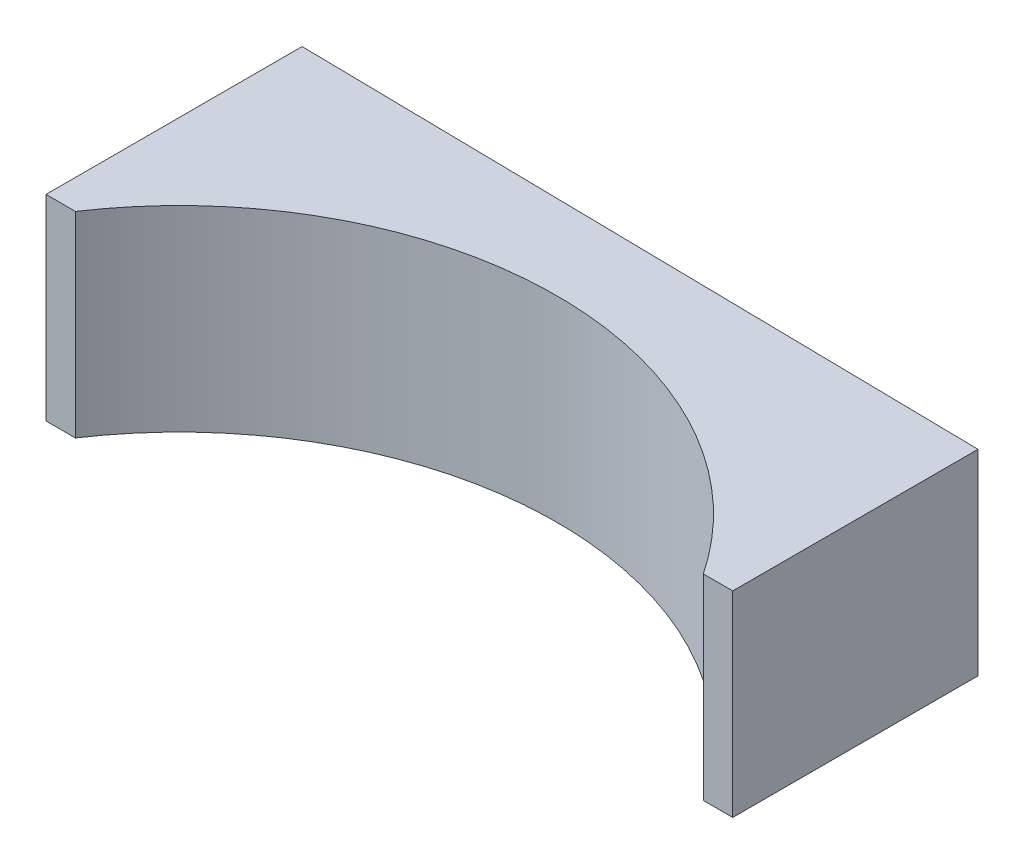
ISO-10303-21;
HEADER;
FILE_DESCRIPTION(('STEP AP214'),'2;1');
FILE_NAME('part.step','',(''),(''),'','','');
FILE_SCHEMA(('AUTOMOTIVE_DESIGN { 1 0 10303 214 1 1 1 1 }'));
ENDSEC;
DATA;
#1=APPLICATION_CONTEXT('core data for automotive mechanical design processes');
#2=APPLICATION_PROTOCOL_DEFINITION('international standard','automotive_design',2000,#1);
#3=PRODUCT_CONTEXT('',#1,'mechanical');
#4=PRODUCT('Part','Part','',(#3));
#5=PRODUCT_RELATED_PRODUCT_CATEGORY('part','',(#4));
#6=PRODUCT_DEFINITION_FORMATION('','',#4);
#7=PRODUCT_DEFINITION_CONTEXT('part definition',#1,'design');
#8=PRODUCT_DEFINITION('design','',#6,#7);
#9=PRODUCT_DEFINITION_SHAPE('','',#8);
#10=(LENGTH_UNIT() NAMED_UNIT(*) SI_UNIT(.MILLI.,.METRE.));
#11=(NAMED_UNIT(*) PLANE_ANGLE_UNIT() SI_UNIT($,.RADIAN.));
#12=(NAMED_UNIT(*) SI_UNIT($,.STERADIAN.) SOLID_ANGLE_UNIT());
#13=UNCERTAINTY_MEASURE_WITH_UNIT(LENGTH_MEASURE(1.E-05),#10,'distance_accuracy_value','');
#14=(GEOMETRIC_REPRESENTATION_CONTEXT(3) GLOBAL_UNCERTAINTY_ASSIGNED_CONTEXT((#13)) GLOBAL_UNIT_ASSIGNED_CONTEXT((#10,
#11,#12)) REPRESENTATION_CONTEXT('',''));
#15=CARTESIAN_POINT('',(0.,0.,0.));
#16=DIRECTION('',(0.,0.,1.));
#17=DIRECTION('',(1.,0.,0.));
#18=AXIS2_PLACEMENT_3D('',#15,#16,#17);
#19=CARTESIAN_POINT('',(-35.,-20.,-21.4067746286076));
#20=DIRECTION('',(0.,0.,-1.));
#21=DIRECTION('',(-1.,0.,0.));
#22=AXIS2_PLACEMENT_3D('',#19,#20,#21);
#23=PLANE('',#22);
#24=DIRECTION('',(-1.,0.,0.));
#25=VECTOR('',#24,1.);
#26=CARTESIAN_POINT('',(-35.,0.,-21.4067746286076));
#27=LINE('',#26,#25);
#28=CARTESIAN_POINT('',(-32.,0.,-21.4067746286076));
#29=VERTEX_POINT('',#28);
#30=CARTESIAN_POINT('',(-35.,0.,-21.4067746286076));
#31=VERTEX_POINT('',#30);
#32=EDGE_CURVE('E121',#29,#31,#27,.T.);
#33=ORIENTED_EDGE('',*,*,#32,.T.);
#34=DIRECTION('',(0.,1.,0.));
#35=VECTOR('',#34,1.);
#36=CARTESIAN_POINT('',(-35.,-20.,-21.4067746286076));
#37=LINE('',#36,#35);
#38=CARTESIAN_POINT('',(-35.,-20.,-21.4067746286076));
#39=VERTEX_POINT('',#38);
#40=EDGE_CURVE('E11',#39,#31,#37,.T.);
#41=ORIENTED_EDGE('',*,*,#40,.F.);
#42=DIRECTION('',(-1.,0.,0.));
#43=VECTOR('',#42,1.);
#44=CARTESIAN_POINT('',(-35.,-20.,-21.4067746286076));
#45=LINE('',#44,#43);
#46=CARTESIAN_POINT('',(-32.,-20.,-21.4067746286076));
#47=VERTEX_POINT('',#46);
#48=EDGE_CURVE('E131',#47,#39,#45,.T.);
#49=ORIENTED_EDGE('',*,*,#48,.F.);
#50=DIRECTION('',(0.,1.,0.));
#51=VECTOR('',#50,1.);
#52=CARTESIAN_POINT('',(-32.,-20.,-21.4067746286076));
#53=LINE('',#52,#51);
#54=EDGE_CURVE('E117',#47,#29,#53,.T.);
#55=ORIENTED_EDGE('',*,*,#54,.T.);
#56=EDGE_LOOP('',(#33,#41,#49,#55));
#57=FACE_BOUND('',#56,.T.);
#58=ADVANCED_FACE('F37',(#57),#23,.F.);
#59=CARTESIAN_POINT('',(-35.,-20.,-21.4067746286076));
#60=DIRECTION('',(1.,0.,0.));
#61=DIRECTION('',(0.,0.,-1.));
#62=AXIS2_PLACEMENT_3D('',#59,#60,#61);
#63=PLANE('',#62);
#64=DIRECTION('',(0.,0.,-1.));
#65=VECTOR('',#64,1.);
#66=CARTESIAN_POINT('',(-35.,0.,-21.4067746286076));
#67=LINE('',#66,#65);
#68=CARTESIAN_POINT('',(-35.,0.,-47.513101044593));
#69=VERTEX_POINT('',#68);
#70=EDGE_CURVE('E124',#31,#69,#67,.T.);
#71=ORIENTED_EDGE('',*,*,#70,.T.);
#72=DIRECTION('',(0.,1.,0.));
#73=VECTOR('',#72,1.);
#74=CARTESIAN_POINT('',(-35.,-20.,-47.513101044593));
#75=LINE('',#74,#73);
#76=CARTESIAN_POINT('',(-35.,-20.,-47.513101044593));
#77=VERTEX_POINT('',#76);
#78=EDGE_CURVE('E45',#77,#69,#75,.T.);
#79=ORIENTED_EDGE('',*,*,#78,.F.);
#80=DIRECTION('',(0.,0.,-1.));
#81=VECTOR('',#80,1.);
#82=CARTESIAN_POINT('',(-35.,-20.,-21.4067746286076));
#83=LINE('',#82,#81);
#84=EDGE_CURVE('E90',#39,#77,#83,.T.);
#85=ORIENTED_EDGE('',*,*,#84,.F.);
#86=ORIENTED_EDGE('',*,*,#40,.T.);
#87=EDGE_LOOP('',(#71,#79,#85,#86));
#88=FACE_BOUND('',#87,.T.);
#89=ADVANCED_FACE('F155',(#88),#63,.F.);
#90=CARTESIAN_POINT('',(-35.,-20.,-47.513101044593));
#91=DIRECTION('',(-0.0158026895525667,0.,0.999875129705157));
#92=DIRECTION('',(0.999875129705157,0.,0.0158026895525667));
#93=AXIS2_PLACEMENT_3D('',#90,#91,#92);
#94=PLANE('',#93);
#95=DIRECTION('',(0.999875129705157,0.,0.0158026895525667));
#96=VECTOR('',#95,1.);
#97=CARTESIAN_POINT('',(-35.,0.,-47.513101044593));
#98=LINE('',#97,#96);
#99=CARTESIAN_POINT('',(35.,0.,-46.4067746286076));
#100=VERTEX_POINT('',#99);
#101=EDGE_CURVE('E126',#69,#100,#98,.T.);
#102=ORIENTED_EDGE('',*,*,#101,.T.);
#103=DIRECTION('',(0.,1.,0.));
#104=VECTOR('',#103,1.);
#105=CARTESIAN_POINT('',(35.,-20.,-46.4067746286076));
#106=LINE('',#105,#104);
#107=CARTESIAN_POINT('',(35.,-20.,-46.4067746286076));
#108=VERTEX_POINT('',#107);
#109=EDGE_CURVE('E112',#108,#100,#106,.T.);
#110=ORIENTED_EDGE('',*,*,#109,.F.);
#111=DIRECTION('',(0.999875129705157,0.,0.0158026895525667));
#112=VECTOR('',#111,1.);
#113=CARTESIAN_POINT('',(-35.,-20.,-47.513101044593));
#114=LINE('',#113,#112);
#115=EDGE_CURVE('E103',#77,#108,#114,.T.);
#116=ORIENTED_EDGE('',*,*,#115,.F.);
#117=ORIENTED_EDGE('',*,*,#78,.T.);
#118=EDGE_LOOP('',(#102,#110,#116,#117));
#119=FACE_BOUND('',#118,.T.);
#120=ADVANCED_FACE('F137',(#119),#94,.F.);
#121=CARTESIAN_POINT('',(35.,-20.,-46.4067746286076));
#122=DIRECTION('',(-1.,0.,0.));
#123=DIRECTION('',(0.,0.,1.));
#124=AXIS2_PLACEMENT_3D('',#121,#122,#123);
#125=PLANE('',#124);
#126=DIRECTION('',(0.,0.,1.));
#127=VECTOR('',#126,1.);
#128=CARTESIAN_POINT('',(35.,0.,-46.4067746286076));
#129=LINE('',#128,#127);
#130=CARTESIAN_POINT('',(35.,0.,-21.4067746286076));
#131=VERTEX_POINT('',#130);
#132=EDGE_CURVE('E111',#100,#131,#129,.T.);
#133=ORIENTED_EDGE('',*,*,#132,.T.);
#134=DIRECTION('',(0.,1.,0.));
#135=VECTOR('',#134,1.);
#136=CARTESIAN_POINT('',(35.,-20.,-21.4067746286076));
#137=LINE('',#136,#135);
#138=CARTESIAN_POINT('',(35.,-20.,-21.4067746286076));
#139=VERTEX_POINT('',#138);
#140=EDGE_CURVE('E108',#139,#131,#137,.T.);
#141=ORIENTED_EDGE('',*,*,#140,.F.);
#142=DIRECTION('',(0.,0.,1.));
#143=VECTOR('',#142,1.);
#144=CARTESIAN_POINT('',(35.,-20.,-46.4067746286076));
#145=LINE('',#144,#143);
#146=EDGE_CURVE('E97',#108,#139,#145,.T.);
#147=ORIENTED_EDGE('',*,*,#146,.F.);
#148=ORIENTED_EDGE('',*,*,#109,.T.);
#149=EDGE_LOOP('',(#133,#141,#147,#148));
#150=FACE_BOUND('',#149,.T.);
#151=ADVANCED_FACE('F109',(#150),#125,.F.);
#152=CARTESIAN_POINT('',(35.,-20.,-21.4067746286076));
#153=DIRECTION('',(0.,0.,-1.));
#154=DIRECTION('',(-1.,0.,0.));
#155=AXIS2_PLACEMENT_3D('',#152,#153,#154);
#156=PLANE('',#155);
#157=DIRECTION('',(-1.,0.,0.));
#158=VECTOR('',#157,1.);
#159=CARTESIAN_POINT('',(35.,0.,-21.4067746286076));
#160=LINE('',#159,#158);
#161=CARTESIAN_POINT('',(32.,0.,-21.4067746286076));
#162=VERTEX_POINT('',#161);
#163=EDGE_CURVE('E76',#131,#162,#160,.T.);
#164=ORIENTED_EDGE('',*,*,#163,.T.);
#165=DIRECTION('',(0.,1.,0.));
#166=VECTOR('',#165,1.);
#167=CARTESIAN_POINT('',(32.,-20.,-21.4067746286076));
#168=LINE('',#167,#166);
#169=CARTESIAN_POINT('',(32.,-20.,-21.4067746286076));
#170=VERTEX_POINT('',#169);
#171=EDGE_CURVE('E113',#170,#162,#168,.T.);
#172=ORIENTED_EDGE('',*,*,#171,.F.);
#173=DIRECTION('',(-1.,0.,0.));
#174=VECTOR('',#173,1.);
#175=CARTESIAN_POINT('',(35.,-20.,-21.4067746286076));
#176=LINE('',#175,#174);
#177=EDGE_CURVE('E101',#139,#170,#176,.T.);
#178=ORIENTED_EDGE('',*,*,#177,.F.);
#179=ORIENTED_EDGE('',*,*,#140,.T.);
#180=EDGE_LOOP('',(#164,#172,#178,#179));
#181=FACE_BOUND('',#180,.T.);
#182=ADVANCED_FACE('F115',(#181),#156,.F.);
#183=CARTESIAN_POINT('',(0.,-20.,0.));
#184=DIRECTION('',(0.,1.,0.));
#185=DIRECTION('',(0.,0.,1.));
#186=AXIS2_PLACEMENT_3D('',#183,#184,#185);
#187=CYLINDRICAL_SURFACE('',#186,38.5);
#188=CARTESIAN_POINT('',(0.,0.,0.));
#189=DIRECTION('',(0.,1.,0.));
#190=DIRECTION('',(0.,0.,-1.));
#191=AXIS2_PLACEMENT_3D('',#188,#189,#190);
#192=CIRCLE('',#191,38.5);
#193=EDGE_CURVE('E82',#162,#29,#192,.T.);
#194=ORIENTED_EDGE('',*,*,#193,.T.);
#195=ORIENTED_EDGE('',*,*,#54,.F.);
#196=CARTESIAN_POINT('',(0.,-20.,0.));
#197=DIRECTION('',(0.,1.,0.));
#198=DIRECTION('',(0.,0.,-1.));
#199=AXIS2_PLACEMENT_3D('',#196,#197,#198);
#200=CIRCLE('',#199,38.5);
#201=EDGE_CURVE('E53',#170,#47,#200,.T.);
#202=ORIENTED_EDGE('',*,*,#201,.F.);
#203=ORIENTED_EDGE('',*,*,#171,.T.);
#204=EDGE_LOOP('',(#194,#195,#202,#203));
#205=FACE_BOUND('',#204,.T.);
#206=ADVANCED_FACE('F144',(#205),#187,.F.);
#207=CARTESIAN_POINT('',(0.,-20.,0.));
#208=DIRECTION('',(0.,-1.,0.));
#209=DIRECTION('',(0.,0.,-1.));
#210=AXIS2_PLACEMENT_3D('',#207,#208,#209);
#211=PLANE('',#210);
#212=ORIENTED_EDGE('',*,*,#48,.T.);
#213=ORIENTED_EDGE('',*,*,#84,.T.);
#214=ORIENTED_EDGE('',*,*,#115,.T.);
#215=ORIENTED_EDGE('',*,*,#146,.T.);
#216=ORIENTED_EDGE('',*,*,#177,.T.);
#217=ORIENTED_EDGE('',*,*,#201,.T.);
#218=EDGE_LOOP('',(#212,#213,#214,#215,#216,#217));
#219=FACE_BOUND('',#218,.T.);
#220=ADVANCED_FACE('F99',(#219),#211,.T.);
#221=CARTESIAN_POINT('',(0.,0.,0.));
#222=DIRECTION('',(0.,-1.,0.));
#223=DIRECTION('',(0.,0.,-1.));
#224=AXIS2_PLACEMENT_3D('',#221,#222,#223);
#225=PLANE('',#224);
#226=ORIENTED_EDGE('',*,*,#32,.F.);
#227=ORIENTED_EDGE('',*,*,#193,.F.);
#228=ORIENTED_EDGE('',*,*,#163,.F.);
#229=ORIENTED_EDGE('',*,*,#132,.F.);
#230=ORIENTED_EDGE('',*,*,#101,.F.);
#231=ORIENTED_EDGE('',*,*,#70,.F.);
#232=EDGE_LOOP('',(#226,#227,#228,#229,#230,#231));
#233=FACE_BOUND('',#232,.T.);
#234=ADVANCED_FACE('F140',(#233),#225,.F.);
#235=CLOSED_SHELL('',(#58,#89,#120,#151,#182,#206,#220,#234));
#236=MANIFOLD_SOLID_BREP('B2',#235);
#237=ADVANCED_BREP_SHAPE_REPRESENTATION('',(#18,#236),#14);
#238=SHAPE_DEFINITION_REPRESENTATION(#9,#237);
ENDSEC;
END-ISO-10303-21;
